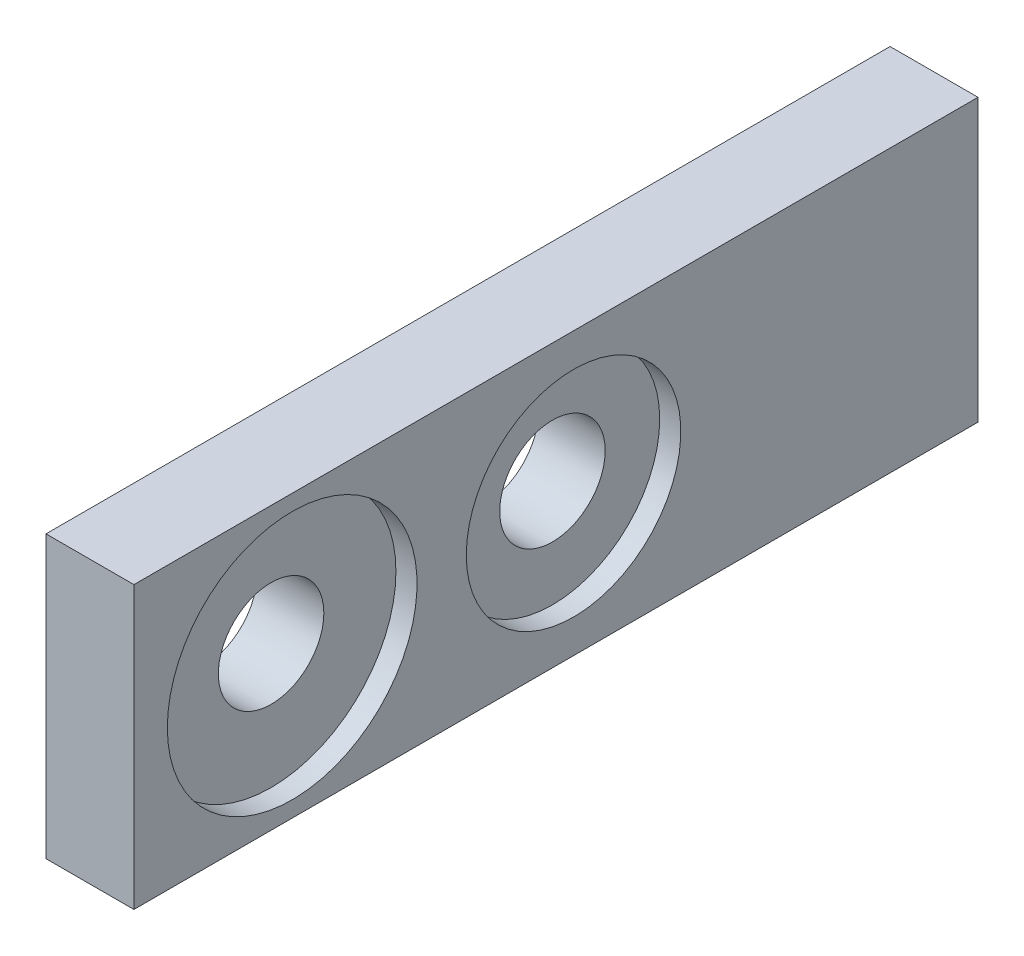
ISO-10303-21;
HEADER;
FILE_DESCRIPTION(('STEP AP214'),'2;1');
FILE_NAME('part.step','',(''),(''),'','','');
FILE_SCHEMA(('AUTOMOTIVE_DESIGN { 1 0 10303 214 1 1 1 1 }'));
ENDSEC;
DATA;
#1=APPLICATION_CONTEXT('core data for automotive mechanical design processes');
#2=APPLICATION_PROTOCOL_DEFINITION('international standard','automotive_design',2000,#1);
#3=PRODUCT_CONTEXT('',#1,'mechanical');
#4=PRODUCT('Part','Part','',(#3));
#5=PRODUCT_RELATED_PRODUCT_CATEGORY('part','',(#4));
#6=PRODUCT_DEFINITION_FORMATION('','',#4);
#7=PRODUCT_DEFINITION_CONTEXT('part definition',#1,'design');
#8=PRODUCT_DEFINITION('design','',#6,#7);
#9=PRODUCT_DEFINITION_SHAPE('','',#8);
#10=(LENGTH_UNIT() NAMED_UNIT(*) SI_UNIT(.MILLI.,.METRE.));
#11=(NAMED_UNIT(*) PLANE_ANGLE_UNIT() SI_UNIT($,.RADIAN.));
#12=(NAMED_UNIT(*) SI_UNIT($,.STERADIAN.) SOLID_ANGLE_UNIT());
#13=UNCERTAINTY_MEASURE_WITH_UNIT(LENGTH_MEASURE(1.E-05),#10,'distance_accuracy_value','');
#14=(GEOMETRIC_REPRESENTATION_CONTEXT(3) GLOBAL_UNCERTAINTY_ASSIGNED_CONTEXT((#13)) GLOBAL_UNIT_ASSIGNED_CONTEXT((#10,
#11,#12)) REPRESENTATION_CONTEXT('',''));
#15=CARTESIAN_POINT('',(0.,0.,0.));
#16=DIRECTION('',(0.,0.,1.));
#17=DIRECTION('',(1.,0.,0.));
#18=AXIS2_PLACEMENT_3D('',#15,#16,#17);
#19=CARTESIAN_POINT('',(58.6,-2.05,151.1));
#20=DIRECTION('',(-1.,0.,0.));
#21=DIRECTION('',(0.,0.,1.));
#22=AXIS2_PLACEMENT_3D('',#19,#20,#21);
#23=PLANE('',#22);
#24=DIRECTION('',(0.,1.,0.));
#25=VECTOR('',#24,1.);
#26=CARTESIAN_POINT('',(58.6,-2.05,148.9));
#27=LINE('',#26,#25);
#28=CARTESIAN_POINT('',(58.6,-2.05,148.9));
#29=VERTEX_POINT('',#28);
#30=CARTESIAN_POINT('',(58.6,2.05,148.9));
#31=VERTEX_POINT('',#30);
#32=EDGE_CURVE('E181',#29,#31,#27,.T.);
#33=ORIENTED_EDGE('',*,*,#32,.F.);
#34=DIRECTION('',(0.,0.,-1.));
#35=VECTOR('',#34,1.);
#36=CARTESIAN_POINT('',(58.6,-2.05,151.1));
#37=LINE('',#36,#35);
#38=CARTESIAN_POINT('',(58.6,-2.05,151.1));
#39=VERTEX_POINT('',#38);
#40=EDGE_CURVE('E206',#39,#29,#37,.T.);
#41=ORIENTED_EDGE('',*,*,#40,.F.);
#42=DIRECTION('',(0.,1.,0.));
#43=VECTOR('',#42,1.);
#44=CARTESIAN_POINT('',(58.6,-2.05,151.1));
#45=LINE('',#44,#43);
#46=CARTESIAN_POINT('',(58.6,2.05,151.1));
#47=VERTEX_POINT('',#46);
#48=EDGE_CURVE('E190',#39,#47,#45,.T.);
#49=ORIENTED_EDGE('',*,*,#48,.T.);
#50=DIRECTION('',(0.,0.,-1.));
#51=VECTOR('',#50,1.);
#52=CARTESIAN_POINT('',(58.6,2.05,151.1));
#53=LINE('',#52,#51);
#54=EDGE_CURVE('E197',#47,#31,#53,.T.);
#55=ORIENTED_EDGE('',*,*,#54,.T.);
#56=EDGE_LOOP('',(#33,#41,#49,#55));
#57=FACE_BOUND('',#56,.T.);
#58=DIRECTION('',(0.,1.,0.));
#59=VECTOR('',#58,1.);
#60=CARTESIAN_POINT('',(58.6,-2.05,149.5));
#61=LINE('',#60,#59);
#62=CARTESIAN_POINT('',(58.6,-1.75,149.5));
#63=VERTEX_POINT('',#62);
#64=CARTESIAN_POINT('',(58.6,1.75,149.5));
#65=VERTEX_POINT('',#64);
#66=EDGE_CURVE('E57',#63,#65,#61,.T.);
#67=ORIENTED_EDGE('',*,*,#66,.T.);
#68=DIRECTION('',(0.,0.,1.));
#69=VECTOR('',#68,1.);
#70=CARTESIAN_POINT('',(58.6,1.75,151.1));
#71=LINE('',#70,#69);
#72=CARTESIAN_POINT('',(58.6,1.75,150.5));
#73=VERTEX_POINT('',#72);
#74=EDGE_CURVE('E11',#65,#73,#71,.T.);
#75=ORIENTED_EDGE('',*,*,#74,.T.);
#76=DIRECTION('',(0.,-1.,0.));
#77=VECTOR('',#76,1.);
#78=CARTESIAN_POINT('',(58.6,-2.05,150.5));
#79=LINE('',#78,#77);
#80=CARTESIAN_POINT('',(58.6,-1.75,150.5));
#81=VERTEX_POINT('',#80);
#82=EDGE_CURVE('E270',#73,#81,#79,.T.);
#83=ORIENTED_EDGE('',*,*,#82,.T.);
#84=DIRECTION('',(0.,0.,1.));
#85=VECTOR('',#84,1.);
#86=CARTESIAN_POINT('',(58.6,-1.75,151.1));
#87=LINE('',#86,#85);
#88=EDGE_CURVE('E266',#63,#81,#87,.T.);
#89=ORIENTED_EDGE('',*,*,#88,.F.);
#90=EDGE_LOOP('',(#67,#75,#83,#89));
#91=FACE_BOUND('',#90,.T.);
#92=ADVANCED_FACE('F47',(#57,#91),#23,.T.);
#93=CARTESIAN_POINT('',(55.6,-8.,190.));
#94=DIRECTION('',(1.,0.,0.));
#95=DIRECTION('',(0.,0.,-1.));
#96=AXIS2_PLACEMENT_3D('',#93,#94,#95);
#97=PLANE('',#96);
#98=CARTESIAN_POINT('',(55.6,0.,181.));
#99=DIRECTION('',(1.,0.,0.));
#100=DIRECTION('',(0.,0.,-1.));
#101=AXIS2_PLACEMENT_3D('',#98,#99,#100);
#102=CIRCLE('',#101,3.);
#103=CARTESIAN_POINT('',(55.6,0.,178.));
#104=VERTEX_POINT('',#103);
#105=EDGE_CURVE('E292',#104,#104,#102,.F.);
#106=ORIENTED_EDGE('',*,*,#105,.F.);
#107=EDGE_LOOP('',(#106));
#108=FACE_BOUND('',#107,.T.);
#109=CARTESIAN_POINT('',(55.6,0.,165.));
#110=DIRECTION('',(1.,0.,0.));
#111=DIRECTION('',(0.,0.,-1.));
#112=AXIS2_PLACEMENT_3D('',#109,#110,#111);
#113=CIRCLE('',#112,3.);
#114=CARTESIAN_POINT('',(55.6,0.,162.));
#115=VERTEX_POINT('',#114);
#116=EDGE_CURVE('E283',#115,#115,#113,.F.);
#117=ORIENTED_EDGE('',*,*,#116,.F.);
#118=EDGE_LOOP('',(#117));
#119=FACE_BOUND('',#118,.T.);
#120=DIRECTION('',(0.,-1.,0.));
#121=VECTOR('',#120,1.);
#122=CARTESIAN_POINT('',(55.6,-8.,142.));
#123=LINE('',#122,#121);
#124=CARTESIAN_POINT('',(55.6,8.,142.));
#125=VERTEX_POINT('',#124);
#126=CARTESIAN_POINT('',(55.6,-8.,142.));
#127=VERTEX_POINT('',#126);
#128=EDGE_CURVE('E210',#125,#127,#123,.T.);
#129=ORIENTED_EDGE('',*,*,#128,.T.);
#130=DIRECTION('',(0.,0.,-1.));
#131=VECTOR('',#130,1.);
#132=CARTESIAN_POINT('',(55.6,-8.,190.));
#133=LINE('',#132,#131);
#134=CARTESIAN_POINT('',(55.6,-8.,190.));
#135=VERTEX_POINT('',#134);
#136=EDGE_CURVE('E248',#135,#127,#133,.T.);
#137=ORIENTED_EDGE('',*,*,#136,.F.);
#138=DIRECTION('',(0.,-1.,0.));
#139=VECTOR('',#138,1.);
#140=CARTESIAN_POINT('',(55.6,-8.,190.));
#141=LINE('',#140,#139);
#142=CARTESIAN_POINT('',(55.6,8.,190.));
#143=VERTEX_POINT('',#142);
#144=EDGE_CURVE('E211',#143,#135,#141,.T.);
#145=ORIENTED_EDGE('',*,*,#144,.F.);
#146=DIRECTION('',(0.,0.,-1.));
#147=VECTOR('',#146,1.);
#148=CARTESIAN_POINT('',(55.6,8.,190.));
#149=LINE('',#148,#147);
#150=EDGE_CURVE('E225',#143,#125,#149,.T.);
#151=ORIENTED_EDGE('',*,*,#150,.T.);
#152=EDGE_LOOP('',(#129,#137,#145,#151));
#153=FACE_BOUND('',#152,.T.);
#154=DIRECTION('',(0.,1.,0.));
#155=VECTOR('',#154,1.);
#156=CARTESIAN_POINT('',(55.6,-8.,151.1));
#157=LINE('',#156,#155);
#158=CARTESIAN_POINT('',(55.6,-2.05,151.1));
#159=VERTEX_POINT('',#158);
#160=CARTESIAN_POINT('',(55.6,2.05,151.1));
#161=VERTEX_POINT('',#160);
#162=EDGE_CURVE('E263',#159,#161,#157,.T.);
#163=ORIENTED_EDGE('',*,*,#162,.F.);
#164=DIRECTION('',(0.,0.,1.));
#165=VECTOR('',#164,1.);
#166=CARTESIAN_POINT('',(55.6,-2.05,190.));
#167=LINE('',#166,#165);
#168=CARTESIAN_POINT('',(55.6,-2.05,148.9));
#169=VERTEX_POINT('',#168);
#170=EDGE_CURVE('E260',#169,#159,#167,.T.);
#171=ORIENTED_EDGE('',*,*,#170,.F.);
#172=DIRECTION('',(0.,1.,0.));
#173=VECTOR('',#172,1.);
#174=CARTESIAN_POINT('',(55.6,-8.,148.9));
#175=LINE('',#174,#173);
#176=CARTESIAN_POINT('',(55.6,2.05,148.9));
#177=VERTEX_POINT('',#176);
#178=EDGE_CURVE('E252',#169,#177,#175,.T.);
#179=ORIENTED_EDGE('',*,*,#178,.T.);
#180=DIRECTION('',(0.,0.,-1.));
#181=VECTOR('',#180,1.);
#182=CARTESIAN_POINT('',(55.6,2.05,190.));
#183=LINE('',#182,#181);
#184=EDGE_CURVE('E256',#161,#177,#183,.T.);
#185=ORIENTED_EDGE('',*,*,#184,.F.);
#186=EDGE_LOOP('',(#163,#171,#179,#185));
#187=FACE_BOUND('',#186,.T.);
#188=ADVANCED_FACE('F49',(#108,#119,#153,#187),#97,.F.);
#189=CARTESIAN_POINT('',(55.6,-8.,190.));
#190=DIRECTION('',(0.,1.,0.));
#191=DIRECTION('',(0.,0.,1.));
#192=AXIS2_PLACEMENT_3D('',#189,#190,#191);
#193=PLANE('',#192);
#194=DIRECTION('',(1.,0.,0.));
#195=VECTOR('',#194,1.);
#196=CARTESIAN_POINT('',(55.6,-8.,142.));
#197=LINE('',#196,#195);
#198=CARTESIAN_POINT('',(60.6,-8.,142.));
#199=VERTEX_POINT('',#198);
#200=EDGE_CURVE('E229',#127,#199,#197,.T.);
#201=ORIENTED_EDGE('',*,*,#200,.T.);
#202=DIRECTION('',(0.,0.,-1.));
#203=VECTOR('',#202,1.);
#204=CARTESIAN_POINT('',(60.6,-8.,190.));
#205=LINE('',#204,#203);
#206=CARTESIAN_POINT('',(60.6,-8.,190.));
#207=VERTEX_POINT('',#206);
#208=EDGE_CURVE('E244',#207,#199,#205,.T.);
#209=ORIENTED_EDGE('',*,*,#208,.F.);
#210=DIRECTION('',(1.,0.,0.));
#211=VECTOR('',#210,1.);
#212=CARTESIAN_POINT('',(55.6,-8.,190.));
#213=LINE('',#212,#211);
#214=EDGE_CURVE('E215',#135,#207,#213,.T.);
#215=ORIENTED_EDGE('',*,*,#214,.F.);
#216=ORIENTED_EDGE('',*,*,#136,.T.);
#217=EDGE_LOOP('',(#201,#209,#215,#216));
#218=FACE_BOUND('',#217,.T.);
#219=ADVANCED_FACE('F378',(#218),#193,.F.);
#220=CARTESIAN_POINT('',(60.6,-8.,190.));
#221=DIRECTION('',(-1.,0.,0.));
#222=DIRECTION('',(0.,0.,1.));
#223=AXIS2_PLACEMENT_3D('',#220,#221,#222);
#224=PLANE('',#223);
#225=CARTESIAN_POINT('',(60.6,0.,181.));
#226=DIRECTION('',(-1.,0.,0.));
#227=DIRECTION('',(0.,0.,1.));
#228=AXIS2_PLACEMENT_3D('',#225,#226,#227);
#229=CIRCLE('',#228,7.1);
#230=CARTESIAN_POINT('',(60.6,0.,188.1));
#231=VERTEX_POINT('',#230);
#232=EDGE_CURVE('E284',#231,#231,#229,.F.);
#233=ORIENTED_EDGE('',*,*,#232,.F.);
#234=EDGE_LOOP('',(#233));
#235=FACE_BOUND('',#234,.T.);
#236=CARTESIAN_POINT('',(60.6,0.,165.));
#237=DIRECTION('',(-1.,0.,0.));
#238=DIRECTION('',(0.,0.,1.));
#239=AXIS2_PLACEMENT_3D('',#236,#237,#238);
#240=CIRCLE('',#239,6.09999999999999);
#241=CARTESIAN_POINT('',(60.6,0.,171.1));
#242=VERTEX_POINT('',#241);
#243=EDGE_CURVE('E275',#242,#242,#240,.F.);
#244=ORIENTED_EDGE('',*,*,#243,.F.);
#245=EDGE_LOOP('',(#244));
#246=FACE_BOUND('',#245,.T.);
#247=DIRECTION('',(0.,1.,0.));
#248=VECTOR('',#247,1.);
#249=CARTESIAN_POINT('',(60.6,-8.,142.));
#250=LINE('',#249,#248);
#251=CARTESIAN_POINT('',(60.6,8.,142.));
#252=VERTEX_POINT('',#251);
#253=EDGE_CURVE('E232',#199,#252,#250,.T.);
#254=ORIENTED_EDGE('',*,*,#253,.T.);
#255=DIRECTION('',(0.,0.,-1.));
#256=VECTOR('',#255,1.);
#257=CARTESIAN_POINT('',(60.6,8.,190.));
#258=LINE('',#257,#256);
#259=CARTESIAN_POINT('',(60.6,8.,190.));
#260=VERTEX_POINT('',#259);
#261=EDGE_CURVE('E240',#260,#252,#258,.T.);
#262=ORIENTED_EDGE('',*,*,#261,.F.);
#263=DIRECTION('',(0.,1.,0.));
#264=VECTOR('',#263,1.);
#265=CARTESIAN_POINT('',(60.6,-8.,190.));
#266=LINE('',#265,#264);
#267=EDGE_CURVE('E219',#207,#260,#266,.T.);
#268=ORIENTED_EDGE('',*,*,#267,.F.);
#269=ORIENTED_EDGE('',*,*,#208,.T.);
#270=EDGE_LOOP('',(#254,#262,#268,#269));
#271=FACE_BOUND('',#270,.T.);
#272=ADVANCED_FACE('F399',(#235,#246,#271),#224,.F.);
#273=CARTESIAN_POINT('',(55.6,8.,190.));
#274=DIRECTION('',(0.,-1.,0.));
#275=DIRECTION('',(0.,0.,-1.));
#276=AXIS2_PLACEMENT_3D('',#273,#274,#275);
#277=PLANE('',#276);
#278=DIRECTION('',(-1.,0.,0.));
#279=VECTOR('',#278,1.);
#280=CARTESIAN_POINT('',(55.6,8.,142.));
#281=LINE('',#280,#279);
#282=EDGE_CURVE('E216',#252,#125,#281,.T.);
#283=ORIENTED_EDGE('',*,*,#282,.T.);
#284=ORIENTED_EDGE('',*,*,#150,.F.);
#285=DIRECTION('',(-1.,0.,0.));
#286=VECTOR('',#285,1.);
#287=CARTESIAN_POINT('',(55.6,8.,190.));
#288=LINE('',#287,#286);
#289=EDGE_CURVE('E222',#260,#143,#288,.T.);
#290=ORIENTED_EDGE('',*,*,#289,.F.);
#291=ORIENTED_EDGE('',*,*,#261,.T.);
#292=EDGE_LOOP('',(#283,#284,#290,#291));
#293=FACE_BOUND('',#292,.T.);
#294=ADVANCED_FACE('F392',(#293),#277,.F.);
#295=CARTESIAN_POINT('',(0.,0.,190.));
#296=DIRECTION('',(0.,0.,-1.));
#297=DIRECTION('',(-1.,0.,0.));
#298=AXIS2_PLACEMENT_3D('',#295,#296,#297);
#299=PLANE('',#298);
#300=ORIENTED_EDGE('',*,*,#144,.T.);
#301=ORIENTED_EDGE('',*,*,#214,.T.);
#302=ORIENTED_EDGE('',*,*,#267,.T.);
#303=ORIENTED_EDGE('',*,*,#289,.T.);
#304=EDGE_LOOP('',(#300,#301,#302,#303));
#305=FACE_BOUND('',#304,.T.);
#306=ADVANCED_FACE('F389',(#305),#299,.F.);
#307=CARTESIAN_POINT('',(0.,0.,142.));
#308=DIRECTION('',(0.,0.,-1.));
#309=DIRECTION('',(-1.,0.,0.));
#310=AXIS2_PLACEMENT_3D('',#307,#308,#309);
#311=PLANE('',#310);
#312=ORIENTED_EDGE('',*,*,#128,.F.);
#313=ORIENTED_EDGE('',*,*,#282,.F.);
#314=ORIENTED_EDGE('',*,*,#253,.F.);
#315=ORIENTED_EDGE('',*,*,#200,.F.);
#316=EDGE_LOOP('',(#312,#313,#314,#315));
#317=FACE_BOUND('',#316,.T.);
#318=ADVANCED_FACE('F387',(#317),#311,.T.);
#319=CARTESIAN_POINT('',(55.5,-2.05,151.1));
#320=DIRECTION('',(0.,1.,0.));
#321=DIRECTION('',(0.,0.,1.));
#322=AXIS2_PLACEMENT_3D('',#319,#320,#321);
#323=PLANE('',#322);
#324=ORIENTED_EDGE('',*,*,#170,.T.);
#325=DIRECTION('',(1.,0.,0.));
#326=VECTOR('',#325,1.);
#327=CARTESIAN_POINT('',(55.5,-2.05,151.1));
#328=LINE('',#327,#326);
#329=EDGE_CURVE('E187',#159,#39,#328,.T.);
#330=ORIENTED_EDGE('',*,*,#329,.T.);
#331=ORIENTED_EDGE('',*,*,#40,.T.);
#332=DIRECTION('',(1.,0.,0.));
#333=VECTOR('',#332,1.);
#334=CARTESIAN_POINT('',(55.5,-2.05,148.9));
#335=LINE('',#334,#333);
#336=EDGE_CURVE('E177',#169,#29,#335,.T.);
#337=ORIENTED_EDGE('',*,*,#336,.F.);
#338=EDGE_LOOP('',(#324,#330,#331,#337));
#339=FACE_BOUND('',#338,.T.);
#340=ADVANCED_FACE('F385',(#339),#323,.T.);
#341=CARTESIAN_POINT('',(55.5,2.05,151.1));
#342=DIRECTION('',(0.,-1.,0.));
#343=DIRECTION('',(0.,0.,-1.));
#344=AXIS2_PLACEMENT_3D('',#341,#342,#343);
#345=PLANE('',#344);
#346=ORIENTED_EDGE('',*,*,#184,.T.);
#347=DIRECTION('',(-1.,0.,0.));
#348=VECTOR('',#347,1.);
#349=CARTESIAN_POINT('',(55.5,2.05,148.9));
#350=LINE('',#349,#348);
#351=EDGE_CURVE('E191',#31,#177,#350,.T.);
#352=ORIENTED_EDGE('',*,*,#351,.F.);
#353=ORIENTED_EDGE('',*,*,#54,.F.);
#354=DIRECTION('',(-1.,0.,0.));
#355=VECTOR('',#354,1.);
#356=CARTESIAN_POINT('',(55.5,2.05,151.1));
#357=LINE('',#356,#355);
#358=EDGE_CURVE('E194',#47,#161,#357,.T.);
#359=ORIENTED_EDGE('',*,*,#358,.T.);
#360=EDGE_LOOP('',(#346,#352,#353,#359));
#361=FACE_BOUND('',#360,.T.);
#362=ADVANCED_FACE('F383',(#361),#345,.T.);
#363=CARTESIAN_POINT('',(0.,0.,151.1));
#364=DIRECTION('',(0.,0.,-1.));
#365=DIRECTION('',(-1.,0.,0.));
#366=AXIS2_PLACEMENT_3D('',#363,#364,#365);
#367=PLANE('',#366);
#368=ORIENTED_EDGE('',*,*,#162,.T.);
#369=ORIENTED_EDGE('',*,*,#358,.F.);
#370=ORIENTED_EDGE('',*,*,#48,.F.);
#371=ORIENTED_EDGE('',*,*,#329,.F.);
#372=EDGE_LOOP('',(#368,#369,#370,#371));
#373=FACE_BOUND('',#372,.T.);
#374=ADVANCED_FACE('F427',(#373),#367,.T.);
#375=CARTESIAN_POINT('',(0.,0.,148.9));
#376=DIRECTION('',(0.,0.,-1.));
#377=DIRECTION('',(-1.,0.,0.));
#378=AXIS2_PLACEMENT_3D('',#375,#376,#377);
#379=PLANE('',#378);
#380=ORIENTED_EDGE('',*,*,#336,.T.);
#381=ORIENTED_EDGE('',*,*,#32,.T.);
#382=ORIENTED_EDGE('',*,*,#351,.T.);
#383=ORIENTED_EDGE('',*,*,#178,.F.);
#384=EDGE_LOOP('',(#380,#381,#382,#383));
#385=FACE_BOUND('',#384,.T.);
#386=ADVANCED_FACE('F435',(#385),#379,.F.);
#387=CARTESIAN_POINT('',(51.4,1.75,149.5));
#388=DIRECTION('',(0.,0.,1.));
#389=DIRECTION('',(1.,0.,0.));
#390=AXIS2_PLACEMENT_3D('',#387,#388,#389);
#391=PLANE('',#390);
#392=ORIENTED_EDGE('',*,*,#66,.F.);
#393=DIRECTION('',(-1.,0.,0.));
#394=VECTOR('',#393,1.);
#395=CARTESIAN_POINT('',(51.4,-1.75,149.5));
#396=LINE('',#395,#394);
#397=CARTESIAN_POINT('',(51.4,-1.75,149.5));
#398=VERTEX_POINT('',#397);
#399=EDGE_CURVE('E174',#63,#398,#396,.T.);
#400=ORIENTED_EDGE('',*,*,#399,.T.);
#401=DIRECTION('',(0.,-1.,0.));
#402=VECTOR('',#401,1.);
#403=CARTESIAN_POINT('',(51.4,1.75,149.5));
#404=LINE('',#403,#402);
#405=CARTESIAN_POINT('',(51.4,1.75,149.5));
#406=VERTEX_POINT('',#405);
#407=EDGE_CURVE('E165',#406,#398,#404,.T.);
#408=ORIENTED_EDGE('',*,*,#407,.F.);
#409=DIRECTION('',(-1.,0.,0.));
#410=VECTOR('',#409,1.);
#411=CARTESIAN_POINT('',(51.4,1.75,149.5));
#412=LINE('',#411,#410);
#413=EDGE_CURVE('E151',#65,#406,#412,.T.);
#414=ORIENTED_EDGE('',*,*,#413,.F.);
#415=EDGE_LOOP('',(#392,#400,#408,#414));
#416=FACE_BOUND('',#415,.T.);
#417=ADVANCED_FACE('F172',(#416),#391,.F.);
#418=CARTESIAN_POINT('',(51.4,1.75,150.1));
#419=DIRECTION('',(1.,0.,0.));
#420=DIRECTION('',(0.,0.,-1.));
#421=AXIS2_PLACEMENT_3D('',#418,#419,#420);
#422=PLANE('',#421);
#423=DIRECTION('',(0.,0.,1.));
#424=VECTOR('',#423,1.);
#425=CARTESIAN_POINT('',(51.4,-1.75,150.1));
#426=LINE('',#425,#424);
#427=CARTESIAN_POINT('',(51.4,-1.75,150.1));
#428=VERTEX_POINT('',#427);
#429=EDGE_CURVE('E320',#398,#428,#426,.T.);
#430=ORIENTED_EDGE('',*,*,#429,.T.);
#431=DIRECTION('',(0.,-1.,0.));
#432=VECTOR('',#431,1.);
#433=CARTESIAN_POINT('',(51.4,1.75,150.1));
#434=LINE('',#433,#432);
#435=CARTESIAN_POINT('',(51.4,1.75,150.1));
#436=VERTEX_POINT('',#435);
#437=EDGE_CURVE('E167',#436,#428,#434,.T.);
#438=ORIENTED_EDGE('',*,*,#437,.F.);
#439=DIRECTION('',(0.,0.,1.));
#440=VECTOR('',#439,1.);
#441=CARTESIAN_POINT('',(51.4,1.75,150.1));
#442=LINE('',#441,#440);
#443=EDGE_CURVE('E154',#406,#436,#442,.T.);
#444=ORIENTED_EDGE('',*,*,#443,.F.);
#445=ORIENTED_EDGE('',*,*,#407,.T.);
#446=EDGE_LOOP('',(#430,#438,#444,#445));
#447=FACE_BOUND('',#446,.T.);
#448=ADVANCED_FACE('F164',(#447),#422,.F.);
#449=CARTESIAN_POINT('',(52.2,1.75,150.9));
#450=DIRECTION('',(0.707106781186547,0.,-0.707106781186547));
#451=DIRECTION('',(-0.707106781186548,0.,-0.707106781186548));
#452=AXIS2_PLACEMENT_3D('',#449,#450,#451);
#453=PLANE('',#452);
#454=DIRECTION('',(0.707106781186548,0.,0.707106781186548));
#455=VECTOR('',#454,1.);
#456=CARTESIAN_POINT('',(52.2,-1.75,150.9));
#457=LINE('',#456,#455);
#458=CARTESIAN_POINT('',(52.2,-1.75,150.9));
#459=VERTEX_POINT('',#458);
#460=EDGE_CURVE('E323',#428,#459,#457,.T.);
#461=ORIENTED_EDGE('',*,*,#460,.T.);
#462=DIRECTION('',(0.,-1.,0.));
#463=VECTOR('',#462,1.);
#464=CARTESIAN_POINT('',(52.2,1.75,150.9));
#465=LINE('',#464,#463);
#466=CARTESIAN_POINT('',(52.2,1.75,150.9));
#467=VERTEX_POINT('',#466);
#468=EDGE_CURVE('E183',#467,#459,#465,.T.);
#469=ORIENTED_EDGE('',*,*,#468,.F.);
#470=DIRECTION('',(0.707106781186548,0.,0.707106781186548));
#471=VECTOR('',#470,1.);
#472=CARTESIAN_POINT('',(52.2,1.75,150.9));
#473=LINE('',#472,#471);
#474=EDGE_CURVE('E170',#436,#467,#473,.T.);
#475=ORIENTED_EDGE('',*,*,#474,.F.);
#476=ORIENTED_EDGE('',*,*,#437,.T.);
#477=EDGE_LOOP('',(#461,#469,#475,#476));
#478=FACE_BOUND('',#477,.T.);
#479=ADVANCED_FACE('F362',(#478),#453,.F.);
#480=CARTESIAN_POINT('',(52.8,1.75,150.9));
#481=DIRECTION('',(0.,0.,-1.));
#482=DIRECTION('',(-1.,0.,0.));
#483=AXIS2_PLACEMENT_3D('',#480,#481,#482);
#484=PLANE('',#483);
#485=DIRECTION('',(1.,0.,0.));
#486=VECTOR('',#485,1.);
#487=CARTESIAN_POINT('',(52.8,-1.75,150.9));
#488=LINE('',#487,#486);
#489=CARTESIAN_POINT('',(52.8,-1.75,150.9));
#490=VERTEX_POINT('',#489);
#491=EDGE_CURVE('E326',#459,#490,#488,.T.);
#492=ORIENTED_EDGE('',*,*,#491,.T.);
#493=DIRECTION('',(0.,-1.,0.));
#494=VECTOR('',#493,1.);
#495=CARTESIAN_POINT('',(52.8,1.75,150.9));
#496=LINE('',#495,#494);
#497=CARTESIAN_POINT('',(52.8,1.75,150.9));
#498=VERTEX_POINT('',#497);
#499=EDGE_CURVE('E338',#498,#490,#496,.T.);
#500=ORIENTED_EDGE('',*,*,#499,.F.);
#501=DIRECTION('',(1.,0.,0.));
#502=VECTOR('',#501,1.);
#503=CARTESIAN_POINT('',(52.8,1.75,150.9));
#504=LINE('',#503,#502);
#505=EDGE_CURVE('E308',#467,#498,#504,.T.);
#506=ORIENTED_EDGE('',*,*,#505,.F.);
#507=ORIENTED_EDGE('',*,*,#468,.T.);
#508=EDGE_LOOP('',(#492,#500,#506,#507));
#509=FACE_BOUND('',#508,.T.);
#510=ADVANCED_FACE('F347',(#509),#484,.F.);
#511=CARTESIAN_POINT('',(52.8,1.75,150.5));
#512=DIRECTION('',(-1.,0.,0.));
#513=DIRECTION('',(0.,0.,1.));
#514=AXIS2_PLACEMENT_3D('',#511,#512,#513);
#515=PLANE('',#514);
#516=DIRECTION('',(0.,0.,-1.));
#517=VECTOR('',#516,1.);
#518=CARTESIAN_POINT('',(52.8,-1.75,150.5));
#519=LINE('',#518,#517);
#520=CARTESIAN_POINT('',(52.8,-1.75,150.5));
#521=VERTEX_POINT('',#520);
#522=EDGE_CURVE('E329',#490,#521,#519,.T.);
#523=ORIENTED_EDGE('',*,*,#522,.T.);
#524=DIRECTION('',(0.,-1.,0.));
#525=VECTOR('',#524,1.);
#526=CARTESIAN_POINT('',(52.8,1.75,150.5));
#527=LINE('',#526,#525);
#528=CARTESIAN_POINT('',(52.8,1.75,150.5));
#529=VERTEX_POINT('',#528);
#530=EDGE_CURVE('E317',#529,#521,#527,.T.);
#531=ORIENTED_EDGE('',*,*,#530,.F.);
#532=DIRECTION('',(0.,0.,-1.));
#533=VECTOR('',#532,1.);
#534=CARTESIAN_POINT('',(52.8,1.75,150.5));
#535=LINE('',#534,#533);
#536=EDGE_CURVE('E311',#498,#529,#535,.T.);
#537=ORIENTED_EDGE('',*,*,#536,.F.);
#538=ORIENTED_EDGE('',*,*,#499,.T.);
#539=EDGE_LOOP('',(#523,#531,#537,#538));
#540=FACE_BOUND('',#539,.T.);
#541=ADVANCED_FACE('F357',(#540),#515,.F.);
#542=CARTESIAN_POINT('',(58.8,1.75,150.5));
#543=DIRECTION('',(0.,0.,-1.));
#544=DIRECTION('',(-1.,0.,0.));
#545=AXIS2_PLACEMENT_3D('',#542,#543,#544);
#546=PLANE('',#545);
#547=ORIENTED_EDGE('',*,*,#82,.F.);
#548=DIRECTION('',(1.,0.,0.));
#549=VECTOR('',#548,1.);
#550=CARTESIAN_POINT('',(58.8,1.75,150.5));
#551=LINE('',#550,#549);
#552=EDGE_CURVE('E314',#529,#73,#551,.T.);
#553=ORIENTED_EDGE('',*,*,#552,.F.);
#554=ORIENTED_EDGE('',*,*,#530,.T.);
#555=DIRECTION('',(1.,0.,0.));
#556=VECTOR('',#555,1.);
#557=CARTESIAN_POINT('',(58.8,-1.75,150.5));
#558=LINE('',#557,#556);
#559=EDGE_CURVE('E160',#521,#81,#558,.T.);
#560=ORIENTED_EDGE('',*,*,#559,.T.);
#561=EDGE_LOOP('',(#547,#553,#554,#560));
#562=FACE_BOUND('',#561,.T.);
#563=ADVANCED_FACE('F361',(#562),#546,.F.);
#564=CARTESIAN_POINT('',(0.,1.75,0.));
#565=DIRECTION('',(0.,-1.,0.));
#566=DIRECTION('',(0.,0.,-1.));
#567=AXIS2_PLACEMENT_3D('',#564,#565,#566);
#568=PLANE('',#567);
#569=ORIENTED_EDGE('',*,*,#74,.F.);
#570=ORIENTED_EDGE('',*,*,#413,.T.);
#571=ORIENTED_EDGE('',*,*,#443,.T.);
#572=ORIENTED_EDGE('',*,*,#474,.T.);
#573=ORIENTED_EDGE('',*,*,#505,.T.);
#574=ORIENTED_EDGE('',*,*,#536,.T.);
#575=ORIENTED_EDGE('',*,*,#552,.T.);
#576=EDGE_LOOP('',(#569,#570,#571,#572,#573,#574,#575));
#577=FACE_BOUND('',#576,.T.);
#578=ADVANCED_FACE('F153',(#577),#568,.F.);
#579=CARTESIAN_POINT('',(0.,-1.75,0.));
#580=DIRECTION('',(0.,-1.,0.));
#581=DIRECTION('',(0.,0.,-1.));
#582=AXIS2_PLACEMENT_3D('',#579,#580,#581);
#583=PLANE('',#582);
#584=ORIENTED_EDGE('',*,*,#399,.F.);
#585=ORIENTED_EDGE('',*,*,#88,.T.);
#586=ORIENTED_EDGE('',*,*,#559,.F.);
#587=ORIENTED_EDGE('',*,*,#522,.F.);
#588=ORIENTED_EDGE('',*,*,#491,.F.);
#589=ORIENTED_EDGE('',*,*,#460,.F.);
#590=ORIENTED_EDGE('',*,*,#429,.F.);
#591=EDGE_LOOP('',(#584,#585,#586,#587,#588,#589,#590));
#592=FACE_BOUND('',#591,.T.);
#593=ADVANCED_FACE('F353',(#592),#583,.T.);
#594=CARTESIAN_POINT('',(61.1,0.,165.));
#595=DIRECTION('',(-1.,0.,0.));
#596=DIRECTION('',(0.,0.,1.));
#597=AXIS2_PLACEMENT_3D('',#594,#595,#596);
#598=CYLINDRICAL_SURFACE('',#597,6.09999999999999);
#599=CARTESIAN_POINT('',(59.4,0.,165.));
#600=DIRECTION('',(1.,0.,0.));
#601=DIRECTION('',(0.,0.,-1.));
#602=AXIS2_PLACEMENT_3D('',#599,#600,#601);
#603=CIRCLE('',#602,6.09999999999999);
#604=CARTESIAN_POINT('',(59.4,0.,158.9));
#605=VERTEX_POINT('',#604);
#606=EDGE_CURVE('E279',#605,#605,#603,.T.);
#607=ORIENTED_EDGE('',*,*,#606,.F.);
#608=EDGE_LOOP('',(#607));
#609=FACE_BOUND('',#608,.T.);
#610=ORIENTED_EDGE('',*,*,#243,.T.);
#611=EDGE_LOOP('',(#610));
#612=FACE_BOUND('',#611,.T.);
#613=ADVANCED_FACE('F477',(#609,#612),#598,.F.);
#614=CARTESIAN_POINT('',(59.4,0.,165.));
#615=DIRECTION('',(1.,0.,0.));
#616=DIRECTION('',(0.,0.,-1.));
#617=AXIS2_PLACEMENT_3D('',#614,#615,#616);
#618=PLANE('',#617);
#619=CARTESIAN_POINT('',(59.4,0.,165.));
#620=DIRECTION('',(1.,0.,0.));
#621=DIRECTION('',(0.,0.,-1.));
#622=AXIS2_PLACEMENT_3D('',#619,#620,#621);
#623=CIRCLE('',#622,3.);
#624=CARTESIAN_POINT('',(59.4,0.,162.));
#625=VERTEX_POINT('',#624);
#626=EDGE_CURVE('E280',#625,#625,#623,.F.);
#627=ORIENTED_EDGE('',*,*,#626,.T.);
#628=EDGE_LOOP('',(#627));
#629=FACE_BOUND('',#628,.T.);
#630=ORIENTED_EDGE('',*,*,#606,.T.);
#631=EDGE_LOOP('',(#630));
#632=FACE_BOUND('',#631,.T.);
#633=ADVANCED_FACE('F487',(#629,#632),#618,.T.);
#634=CARTESIAN_POINT('',(59.5,0.,165.));
#635=DIRECTION('',(-1.,0.,0.));
#636=DIRECTION('',(0.,0.,1.));
#637=AXIS2_PLACEMENT_3D('',#634,#635,#636);
#638=CYLINDRICAL_SURFACE('',#637,3.);
#639=ORIENTED_EDGE('',*,*,#626,.F.);
#640=EDGE_LOOP('',(#639));
#641=FACE_BOUND('',#640,.T.);
#642=ORIENTED_EDGE('',*,*,#116,.T.);
#643=EDGE_LOOP('',(#642));
#644=FACE_BOUND('',#643,.T.);
#645=ADVANCED_FACE('F498',(#641,#644),#638,.F.);
#646=CARTESIAN_POINT('',(61.1,0.,181.));
#647=DIRECTION('',(-1.,0.,0.));
#648=DIRECTION('',(0.,0.,1.));
#649=AXIS2_PLACEMENT_3D('',#646,#647,#648);
#650=CYLINDRICAL_SURFACE('',#649,7.1);
#651=CARTESIAN_POINT('',(59.4,0.,181.));
#652=DIRECTION('',(1.,0.,0.));
#653=DIRECTION('',(0.,0.,-1.));
#654=AXIS2_PLACEMENT_3D('',#651,#652,#653);
#655=CIRCLE('',#654,7.1);
#656=CARTESIAN_POINT('',(59.4,0.,173.9));
#657=VERTEX_POINT('',#656);
#658=EDGE_CURVE('E287',#657,#657,#655,.T.);
#659=ORIENTED_EDGE('',*,*,#658,.F.);
#660=EDGE_LOOP('',(#659));
#661=FACE_BOUND('',#660,.T.);
#662=ORIENTED_EDGE('',*,*,#232,.T.);
#663=EDGE_LOOP('',(#662));
#664=FACE_BOUND('',#663,.T.);
#665=ADVANCED_FACE('F506',(#661,#664),#650,.F.);
#666=CARTESIAN_POINT('',(59.4,0.,181.));
#667=DIRECTION('',(1.,0.,0.));
#668=DIRECTION('',(0.,0.,-1.));
#669=AXIS2_PLACEMENT_3D('',#666,#667,#668);
#670=PLANE('',#669);
#671=CARTESIAN_POINT('',(59.4,0.,181.));
#672=DIRECTION('',(1.,0.,0.));
#673=DIRECTION('',(0.,0.,-1.));
#674=AXIS2_PLACEMENT_3D('',#671,#672,#673);
#675=CIRCLE('',#674,3.);
#676=CARTESIAN_POINT('',(59.4,0.,178.));
#677=VERTEX_POINT('',#676);
#678=EDGE_CURVE('E51',#677,#677,#675,.F.);
#679=ORIENTED_EDGE('',*,*,#678,.T.);
#680=EDGE_LOOP('',(#679));
#681=FACE_BOUND('',#680,.T.);
#682=ORIENTED_EDGE('',*,*,#658,.T.);
#683=EDGE_LOOP('',(#682));
#684=FACE_BOUND('',#683,.T.);
#685=ADVANCED_FACE('F516',(#681,#684),#670,.T.);
#686=CARTESIAN_POINT('',(59.5,0.,181.));
#687=DIRECTION('',(-1.,0.,0.));
#688=DIRECTION('',(0.,0.,1.));
#689=AXIS2_PLACEMENT_3D('',#686,#687,#688);
#690=CYLINDRICAL_SURFACE('',#689,3.);
#691=ORIENTED_EDGE('',*,*,#678,.F.);
#692=EDGE_LOOP('',(#691));
#693=FACE_BOUND('',#692,.T.);
#694=ORIENTED_EDGE('',*,*,#105,.T.);
#695=EDGE_LOOP('',(#694));
#696=FACE_BOUND('',#695,.T.);
#697=ADVANCED_FACE('F536',(#693,#696),#690,.F.);
#698=CLOSED_SHELL('',(#92,#188,#219,#272,#294,#306,#318,#340,#362,#374,#386,#417,#448,#479,#510,
#541,#563,#578,#593,#613,#633,#645,#665,#685,#697));
#699=MANIFOLD_SOLID_BREP('B2',#698);
#700=ADVANCED_BREP_SHAPE_REPRESENTATION('',(#18,#699),#14);
#701=SHAPE_DEFINITION_REPRESENTATION(#9,#700);
ENDSEC;
END-ISO-10303-21;
